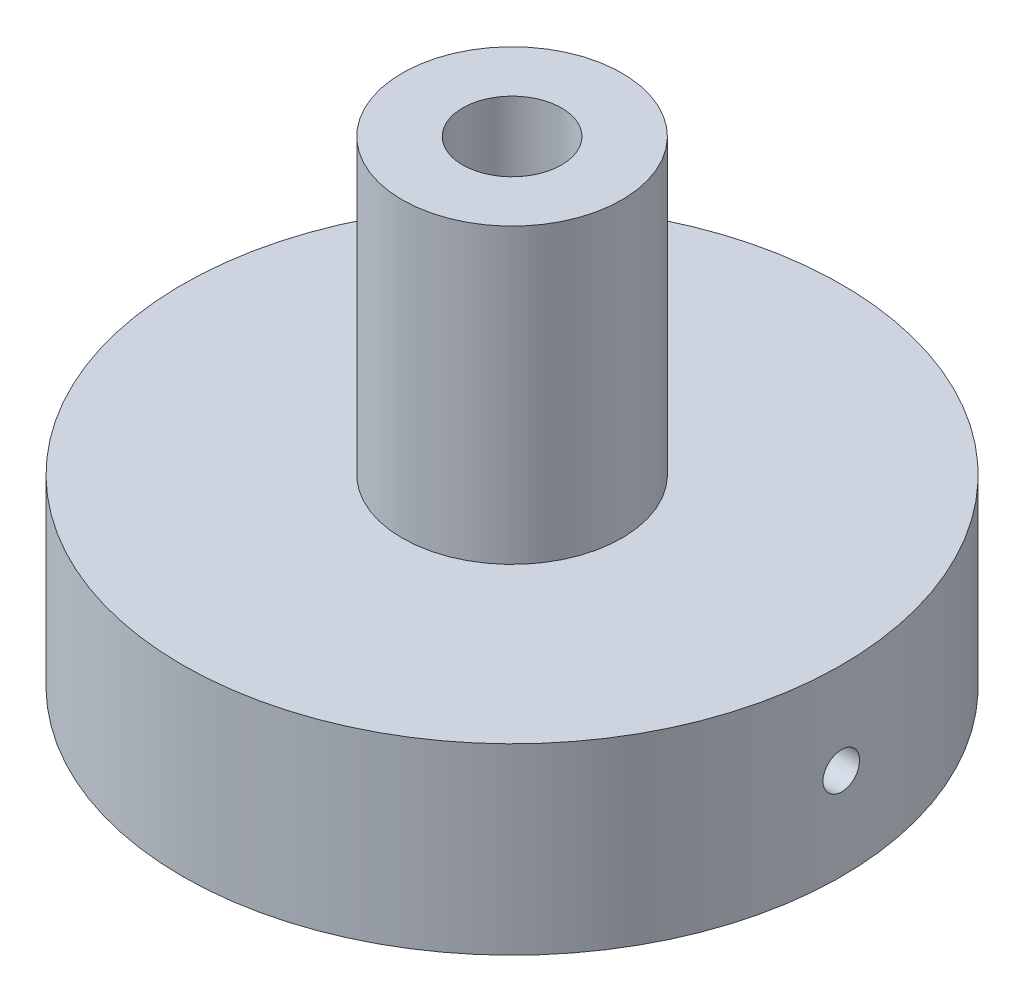
ISO-10303-21;
HEADER;
FILE_DESCRIPTION(('STEP AP214'),'2;1');
FILE_NAME('part.step','',(''),(''),'','','');
FILE_SCHEMA(('AUTOMOTIVE_DESIGN { 1 0 10303 214 1 1 1 1 }'));
ENDSEC;
DATA;
#1=APPLICATION_CONTEXT('core data for automotive mechanical design processes');
#2=APPLICATION_PROTOCOL_DEFINITION('international standard','automotive_design',2000,#1);
#3=PRODUCT_CONTEXT('',#1,'mechanical');
#4=PRODUCT('Part','Part','',(#3));
#5=PRODUCT_RELATED_PRODUCT_CATEGORY('part','',(#4));
#6=PRODUCT_DEFINITION_FORMATION('','',#4);
#7=PRODUCT_DEFINITION_CONTEXT('part definition',#1,'design');
#8=PRODUCT_DEFINITION('design','',#6,#7);
#9=PRODUCT_DEFINITION_SHAPE('','',#8);
#10=(LENGTH_UNIT() NAMED_UNIT(*) SI_UNIT(.MILLI.,.METRE.));
#11=(NAMED_UNIT(*) PLANE_ANGLE_UNIT() SI_UNIT($,.RADIAN.));
#12=(NAMED_UNIT(*) SI_UNIT($,.STERADIAN.) SOLID_ANGLE_UNIT());
#13=UNCERTAINTY_MEASURE_WITH_UNIT(LENGTH_MEASURE(1.E-05),#10,'distance_accuracy_value','');
#14=(GEOMETRIC_REPRESENTATION_CONTEXT(3) GLOBAL_UNCERTAINTY_ASSIGNED_CONTEXT((#13)) GLOBAL_UNIT_ASSIGNED_CONTEXT((#10,
#11,#12)) REPRESENTATION_CONTEXT('',''));
#15=CARTESIAN_POINT('',(0.,0.,0.));
#16=DIRECTION('',(0.,0.,1.));
#17=DIRECTION('',(1.,0.,0.));
#18=AXIS2_PLACEMENT_3D('',#15,#16,#17);
#19=CARTESIAN_POINT('',(0.,2.5,0.));
#20=DIRECTION('',(0.,-1.,0.));
#21=DIRECTION('',(0.,0.,-1.));
#22=AXIS2_PLACEMENT_3D('',#19,#20,#21);
#23=CYLINDRICAL_SURFACE('',#22,4.5);
#24=CARTESIAN_POINT('',(0.,0.,0.));
#25=DIRECTION('',(0.,1.,0.));
#26=DIRECTION('',(0.,0.,1.));
#27=AXIS2_PLACEMENT_3D('',#24,#25,#26);
#28=CIRCLE('',#27,4.5);
#29=CARTESIAN_POINT('',(0.,0.,4.5));
#30=VERTEX_POINT('',#29);
#31=EDGE_CURVE('E80',#30,#30,#28,.T.);
#32=ORIENTED_EDGE('',*,*,#31,.T.);
#33=EDGE_LOOP('',(#32));
#34=FACE_BOUND('',#33,.T.);
#35=CARTESIAN_POINT('',(0.,2.5,0.));
#36=DIRECTION('',(0.,1.,0.));
#37=DIRECTION('',(0.,0.,1.));
#38=AXIS2_PLACEMENT_3D('',#35,#36,#37);
#39=CIRCLE('',#38,4.5);
#40=CARTESIAN_POINT('',(0.,2.5,4.5));
#41=VERTEX_POINT('',#40);
#42=EDGE_CURVE('E79',#41,#41,#39,.T.);
#43=ORIENTED_EDGE('',*,*,#42,.F.);
#44=EDGE_LOOP('',(#43));
#45=FACE_BOUND('',#44,.T.);
#46=CARTESIAN_POINT('',(4.5,1.,0.));
#47=CARTESIAN_POINT('',(4.50000000000079,0.999999982829135,-0.00272645801680544));
#48=CARTESIAN_POINT('',(4.49999899452962,1.00004460080792,-0.00545291505725118));
#49=CARTESIAN_POINT('',(4.49999497264792,1.00022298385369,-0.0109029114291185));
#50=CARTESIAN_POINT('',(4.4999919562363,1.00035674896918,-0.0136264507589518));
#51=CARTESIAN_POINT('',(4.49998391247387,1.00071330327103,-0.0190676959405886));
#52=CARTESIAN_POINT('',(4.49997888512087,1.00093609255424,-0.0217854017860413));
#53=CARTESIAN_POINT('',(4.49996681947701,1.00147045126951,-0.0272120713179232));
#54=CARTESIAN_POINT('',(4.49995978118288,1.00178202084645,-0.0299210349900766));
#55=CARTESIAN_POINT('',(4.49994369365779,1.00249360806718,-0.0353273206292449));
#56=CARTESIAN_POINT('',(4.49993464442246,1.00289362590343,-0.0380246425709125));
#57=CARTESIAN_POINT('',(4.49991453501609,1.00378168105241,-0.0434047577270999));
#58=CARTESIAN_POINT('',(4.49990347483958,1.00426971860457,-0.0460875509020784));
#59=CARTESIAN_POINT('',(4.49987934355194,1.00533329087768,-0.051435737040496));
#60=CARTESIAN_POINT('',(4.49986627243425,1.00590882588424,-0.054101129947108));
#61=CARTESIAN_POINT('',(4.49983811926533,1.00714677697542,-0.0594116626959782));
#62=CARTESIAN_POINT('',(4.49982303720645,1.0078091933909,-0.0620568024610688));
#63=CARTESIAN_POINT('',(4.49979086215626,1.00922019825307,-0.0673239977536585));
#64=CARTESIAN_POINT('',(4.4997737691562,1.00996878707479,-0.0699460531806388));
#65=CARTESIAN_POINT('',(4.49973757222473,1.01155133546066,-0.0751642733351101));
#66=CARTESIAN_POINT('',(4.49971846828349,1.01238529544278,-0.0777604379357708));
#67=CARTESIAN_POINT('',(4.49967824947075,1.01413769348849,-0.0829240976904874));
#68=CARTESIAN_POINT('',(4.49965713458832,1.01505613201163,-0.0854915926884981));
#69=CARTESIAN_POINT('',(4.49961289389431,1.01697650405856,-0.0905951651798567));
#70=CARTESIAN_POINT('',(4.4995897680707,1.01797843808197,-0.0931312424851046));
#71=CARTESIAN_POINT('',(4.49954150549541,1.02006472868197,-0.0981692651632267));
#72=CARTESIAN_POINT('',(4.49951636873061,1.02114908579658,-0.100671210313175));
#73=CARTESIAN_POINT('',(4.49946408427406,1.02339906191263,-0.105638290788664));
#74=CARTESIAN_POINT('',(4.49943693656808,1.02456468148869,-0.108103425853758));
#75=CARTESIAN_POINT('',(4.49938063023024,1.02697593488482,-0.112994247669384));
#76=CARTESIAN_POINT('',(4.49935147158308,1.0282215693142,-0.115419934119338));
#77=CARTESIAN_POINT('',(4.49929114336397,1.03079151913318,-0.120229262440449));
#78=CARTESIAN_POINT('',(4.49925997377563,1.03211583516471,-0.12261290396837));
#79=CARTESIAN_POINT('',(4.49919562367525,1.03484173069043,-0.127335591185935));
#80=CARTESIAN_POINT('',(4.49916244314572,1.03624331085699,-0.129674636487252));
#81=CARTESIAN_POINT('',(4.49909407116407,1.03912223445865,-0.134305627727543));
#82=CARTESIAN_POINT('',(4.49905887969335,1.04059957859425,-0.136597573230767));
#83=CARTESIAN_POINT('',(4.49898648583043,1.04362844884922,-0.141131911765788));
#84=CARTESIAN_POINT('',(4.49894928341853,1.04517997569477,-0.143374304312184));
#85=CARTESIAN_POINT('',(4.49887286767433,1.04835555068674,-0.147807136865045));
#86=CARTESIAN_POINT('',(4.49883365432125,1.0499795995825,-0.149997576334341));
#87=CARTESIAN_POINT('',(4.49875321669578,1.05329848037145,-0.154324158273908));
#88=CARTESIAN_POINT('',(4.49871199240151,1.05499331303448,-0.156460300153239));
#89=CARTESIAN_POINT('',(4.49862753289477,1.05845194729468,-0.160676000572497));
#90=CARTESIAN_POINT('',(4.49858429765932,1.06021574967942,-0.162755558465828));
#91=CARTESIAN_POINT('',(4.49849581627131,1.06381043550163,-0.166855865138515));
#92=CARTESIAN_POINT('',(4.49845057009468,1.06564131974154,-0.168876613213861));
#93=CARTESIAN_POINT('',(4.49835806682538,1.06936820959529,-0.172857137424079));
#94=CARTESIAN_POINT('',(4.49831080970757,1.07126421602349,-0.174816912795898));
#95=CARTESIAN_POINT('',(4.49821428455701,1.07511932087527,-0.178673394035526));
#96=CARTESIAN_POINT('',(4.49816501649801,1.07707842012208,-0.180570099079742));
#97=CARTESIAN_POINT('',(4.49806446946618,1.08105761370492,-0.18429840960862));
#98=CARTESIAN_POINT('',(4.498013190466,1.08307770886993,-0.18613001420779));
#99=CARTESIAN_POINT('',(4.49790862155289,1.08717673209994,-0.189726163471797));
#100=CARTESIAN_POINT('',(4.49785533161153,1.08925566099644,-0.191490707188026));
#101=CARTESIAN_POINT('',(4.49774674081715,1.09347012653142,-0.194950846090327));
#102=CARTESIAN_POINT('',(4.49769143993461,1.09560566400067,-0.196646440263602));
#103=CARTESIAN_POINT('',(4.49757882725895,1.09993106093611,-0.199966865284481));
#104=CARTESIAN_POINT('',(4.49752151543523,1.10212092122898,-0.201591695054174));
#105=CARTESIAN_POINT('',(4.4974048808783,1.10655261992622,-0.204768852215054));
#106=CARTESIAN_POINT('',(4.49734555811339,1.10879445914976,-0.206321178462445));
#107=CARTESIAN_POINT('',(4.49722490167519,1.11332771619126,-0.209351667129848));
#108=CARTESIAN_POINT('',(4.49716356796911,1.11561913481744,-0.210829828339564));
#109=CARTESIAN_POINT('',(4.49703888964963,1.12024909808389,-0.213710404864944));
#110=CARTESIAN_POINT('',(4.49697554500235,1.12258764351791,-0.215112818903346));
#111=CARTESIAN_POINT('',(4.49684684480162,1.12730935738158,-0.217840400094885));
#112=CARTESIAN_POINT('',(4.4967814892132,1.12969252658697,-0.219165565903492));
#113=CARTESIAN_POINT('',(4.49664876713111,1.13450093721595,-0.22173723232616));
#114=CARTESIAN_POINT('',(4.49658140060138,1.13692617939368,-0.222983731528286));
#115=CARTESIAN_POINT('',(4.49644465663835,1.14181614016119,-0.225396730628625));
#116=CARTESIAN_POINT('',(4.49637527916791,1.14428085947991,-0.226563229047523));
#117=CARTESIAN_POINT('',(4.49623451332235,1.14924713647286,-0.228814978099816));
#118=CARTESIAN_POINT('',(4.496163124909,1.1517486948472,-0.2299002271867));
#119=CARTESIAN_POINT('',(4.49601833718687,1.15678597246855,-0.231988316057351));
#120=CARTESIAN_POINT('',(4.49594493783877,1.15932169238319,-0.232991154227767));
#121=CARTESIAN_POINT('',(4.4957961282178,1.16442457904029,-0.234913347954973));
#122=CARTESIAN_POINT('',(4.49572071790453,1.16699174641428,-0.235832701832094));
#123=CARTESIAN_POINT('',(4.49556788646785,1.17215478029394,-0.237586943017981));
#124=CARTESIAN_POINT('',(4.49549046530294,1.17475064739137,-0.238421828581449));
#125=CARTESIAN_POINT('',(4.49533361174032,1.17996830229018,-0.240006239594292));
#126=CARTESIAN_POINT('',(4.49525417930001,1.18259009063992,-0.240755763233599));
#127=CARTESIAN_POINT('',(4.49509330476925,1.18785678193745,-0.242168648217114));
#128=CARTESIAN_POINT('',(4.49501186263515,1.1905016853866,-0.242832007687511));
#129=CARTESIAN_POINT('',(4.49484696281517,1.19581177580535,-0.244071854377526));
#130=CARTESIAN_POINT('',(4.49476350508441,1.19847696322568,-0.244648339660783));
#131=CARTESIAN_POINT('',(4.49459459610223,1.20382476967665,-0.245713820998167));
#132=CARTESIAN_POINT('',(4.49450914480533,1.20650738910385,-0.246202815054747));
#133=CARTESIAN_POINT('',(4.49433616647204,1.21188718573952,-0.247092790627091));
#134=CARTESIAN_POINT('',(4.49424863938719,1.21458436328677,-0.24749377008565));
#135=CARTESIAN_POINT('',(4.49407181633867,1.21999039893776,-0.248207287268497));
#136=CARTESIAN_POINT('',(4.49398252033274,1.22269925731928,-0.248519822877617));
#137=CARTESIAN_POINT('',(4.49380101418655,1.22812571944627,-0.249056118150398));
#138=CARTESIAN_POINT('',(4.49370880397507,1.23084332340399,-0.249279875642798));
#139=CARTESIAN_POINT('',(4.4935257437315,1.23628450183132,-0.249638374300205));
#140=CARTESIAN_POINT('',(4.49343489373348,1.23900807644848,-0.249773113239852));
#141=CARTESIAN_POINT('',(4.49323860136768,1.24445778161076,-0.249953434134212));
#142=CARTESIAN_POINT('',(4.49313315862728,1.24718391221938,-0.249999013811763));
#143=CARTESIAN_POINT('',(4.49298771311119,1.25196411122928,-0.250000714691134));
#144=CARTESIAN_POINT('',(4.49293797980428,1.25401786978539,-0.249976150443854));
#145=CARTESIAN_POINT('',(4.49286090171626,1.2587423349927,-0.249861381992554));
#146=CARTESIAN_POINT('',(4.49284479086705,1.261412799423,-0.24975365630434));
#147=CARTESIAN_POINT('',(4.49282943442006,1.26736621825612,-0.24941780780716));
#148=CARTESIAN_POINT('',(4.49283495339598,1.2706479286171,-0.249167595457754));
#149=CARTESIAN_POINT('',(4.49286892216874,1.27781447841555,-0.248478642029944));
#150=CARTESIAN_POINT('',(4.49290148676499,1.28169675158396,-0.248013306184042));
#151=CARTESIAN_POINT('',(4.49298933184487,1.29004758970573,-0.246813058324371));
#152=CARTESIAN_POINT('',(4.49304739132845,1.29451172540462,-0.24604714199761));
#153=CARTESIAN_POINT('',(4.49314923143775,1.30139865191092,-0.24467204601958));
#154=CARTESIAN_POINT('',(4.49318772949752,1.30383860787431,-0.244146745715539));
#155=CARTESIAN_POINT('',(4.49327106078565,1.30885241831485,-0.242988509008493));
#156=CARTESIAN_POINT('',(4.49331613876742,1.31142519968001,-0.242350919523885));
#157=CARTESIAN_POINT('',(4.49341265963331,1.31669862824194,-0.240954686368067));
#158=CARTESIAN_POINT('',(4.4934643204412,1.3193979752829,-0.240191149588976));
#159=CARTESIAN_POINT('',(4.49357403135637,1.32491749902694,-0.238529089980028));
#160=CARTESIAN_POINT('',(4.49363227670035,1.32773613081184,-0.237625445400186));
#161=CARTESIAN_POINT('',(4.49375517755889,1.33348590041604,-0.235668839974184));
#162=CARTESIAN_POINT('',(4.49382000899489,1.33641521969177,-0.234610543773701));
#163=CARTESIAN_POINT('',(4.49395609986147,1.34237668245577,-0.232330008800951));
#164=CARTESIAN_POINT('',(4.49402751862438,1.34540670712759,-0.231102238200249));
#165=CARTESIAN_POINT('',(4.49417679946166,1.35155840904758,-0.228467959836766));
#166=CARTESIAN_POINT('',(4.49425480651527,1.3546776393715,-0.227055743707505));
#167=CARTESIAN_POINT('',(4.49441727749604,1.36099498141355,-0.224037754976576));
#168=CARTESIAN_POINT('',(4.49450187391544,1.36419029033583,-0.222426120290226));
#169=CARTESIAN_POINT('',(4.49467753440938,1.37064530966527,-0.218994614250967));
#170=CARTESIAN_POINT('',(4.49476871998836,1.37390183372186,-0.217168753051448));
#171=CARTESIAN_POINT('',(4.49495757253684,1.38046299640598,-0.213294435968355));
#172=CARTESIAN_POINT('',(4.49505535151137,1.38376403796181,-0.21123989171534));
#173=CARTESIAN_POINT('',(4.49525738605838,1.39039605168712,-0.206894379967704));
#174=CARTESIAN_POINT('',(4.49536174453342,1.39372298963977,-0.204597258412954));
#175=CARTESIAN_POINT('',(4.49557700091166,1.4003866515969,-0.199753508645682));
#176=CARTESIAN_POINT('',(4.49568799624747,1.4037188794295,-0.197200696740967));
#177=CARTESIAN_POINT('',(4.49591631713308,1.41037092511344,-0.191833515935032));
#178=CARTESIAN_POINT('',(4.49603372522526,1.41368576033887,-0.189012975062287));
#179=CARTESIAN_POINT('',(4.49627573078524,1.42027888452822,-0.18309942698873));
#180=CARTESIAN_POINT('',(4.49640043546482,1.42355168735192,-0.180000298844714));
#181=CARTESIAN_POINT('',(4.49662001390007,1.4291722045677,-0.174382243985315));
#182=CARTESIAN_POINT('',(4.49671497754765,1.43155585843599,-0.171899140260578));
#183=CARTESIAN_POINT('',(4.49690029687421,1.43617664621469,-0.166882218317377));
#184=CARTESIAN_POINT('',(4.4969907047822,1.4384156479319,-0.164350123851721));
#185=CARTESIAN_POINT('',(4.49716759709713,1.44274899063637,-0.15924456421512));
#186=CARTESIAN_POINT('',(4.49725412307402,1.44484523389104,-0.15667271439393));
#187=CARTESIAN_POINT('',(4.49742307100506,1.44889547611028,-0.151496487747561));
#188=CARTESIAN_POINT('',(4.49750553946476,1.45085140330372,-0.148893621143023));
#189=CARTESIAN_POINT('',(4.49766641725435,1.45462381622689,-0.143663809458895));
#190=CARTESIAN_POINT('',(4.49774487400736,1.45644225025838,-0.141038270993097));
#191=CARTESIAN_POINT('',(4.49789771440674,1.45994285786816,-0.135771132001995));
#192=CARTESIAN_POINT('',(4.49797214759215,1.46162699363406,-0.133130836842803));
#193=CARTESIAN_POINT('',(4.49811694207672,1.4648625150029,-0.127841772597173));
#194=CARTESIAN_POINT('',(4.49818735485519,1.46641587097161,-0.125194210099526));
#195=CARTESIAN_POINT('',(4.49832410564259,1.46939363587136,-0.119897767738886));
#196=CARTESIAN_POINT('',(4.49839049727172,1.47082001791427,-0.117249998424132));
#197=CARTESIAN_POINT('',(4.49851920378585,1.47354789323011,-0.111959869165651));
#198=CARTESIAN_POINT('',(4.49858157454562,1.47485135725886,-0.109318526656334));
#199=CARTESIAN_POINT('',(4.49870223693522,1.47733767467581,-0.104047551371939));
#200=CARTESIAN_POINT('',(4.49876058684546,1.47852249167546,-0.101418846018091));
#201=CARTESIAN_POINT('',(4.49887320507607,1.48077597935395,-0.0961790243282553));
#202=CARTESIAN_POINT('',(4.4989275342393,1.48184660202446,-0.0935687486539065));
#203=CARTESIAN_POINT('',(4.49903210830558,1.48387631952315,-0.088371252993345));
#204=CARTESIAN_POINT('',(4.49908241678748,1.48483735055908,-0.0857847902626409));
#205=CARTESIAN_POINT('',(4.49917894674325,1.48665262792431,-0.0806399796695123));
#206=CARTESIAN_POINT('',(4.49922523471807,1.48750879080267,-0.0780823091962128));
#207=CARTESIAN_POINT('',(4.4993137203612,1.48911916935863,-0.0729997593615972));
#208=CARTESIAN_POINT('',(4.49935598766664,1.48987527839251,-0.070475480823052));
#209=CARTESIAN_POINT('',(4.49943642972882,1.49129046211558,-0.0654639690719945));
#210=CARTESIAN_POINT('',(4.49947467745522,1.49195140354947,-0.0629772646477914));
#211=CARTESIAN_POINT('',(4.49954707330151,1.49318118905461,-0.0580449291232673));
#212=CARTESIAN_POINT('',(4.49958129808048,1.49375187074661,-0.0555997550199679));
#213=CARTESIAN_POINT('',(4.499676621652,1.49531341581898,-0.048422072303377));
#214=CARTESIAN_POINT('',(4.49973327289766,1.49620426649772,-0.0436673080763196));
#215=CARTESIAN_POINT('',(4.49982979934251,1.49767006958274,-0.0343596180405833));
#216=CARTESIAN_POINT('',(4.49987038654314,1.49825889293178,-0.0298088634879173));
#217=CARTESIAN_POINT('',(4.49993476336316,1.49916020951983,-0.0209286840898162));
#218=CARTESIAN_POINT('',(4.49995934313319,1.49948593214327,-0.0166006087089088));
#219=CARTESIAN_POINT('',(4.49999144669463,1.49989960887173,-0.00818126580138848));
#220=CARTESIAN_POINT('',(4.49999986569883,1.5000000980725,-0.00409061421390965));
#221=CARTESIAN_POINT('',(4.5,1.5,-2.51505718143839E-13));
#222=B_SPLINE_CURVE_WITH_KNOTS('',3,(#46,#47,#48,#49,#50,#51,#52,#53,#54,#55,#56,#57,#58,#59,
#60,#61,#62,#63,#64,#65,#66,#67,#68,#69,#70,#71,#72,#73,#74,#75,#76,#77,#78,#79,#80,#81,#82,#83,
#84,#85,#86,#87,#88,#89,#90,#91,#92,#93,#94,#95,#96,#97,#98,#99,#100,#101,#102,#103,#104,#105,
#106,#107,#108,#109,#110,#111,#112,#113,#114,#115,#116,#117,#118,#119,#120,#121,#122,#123,#124,
#125,#126,#127,#128,#129,#130,#131,#132,#133,#134,#135,#136,#137,#138,#139,#140,#141,#142,#143,
#144,#145,#146,#147,#148,#149,#150,#151,#152,#153,#154,#155,#156,#157,#158,#159,#160,#161,#162,
#163,#164,#165,#166,#167,#168,#169,#170,#171,#172,#173,#174,#175,#176,#177,#178,#179,#180,#181,
#182,#183,#184,#185,#186,#187,#188,#189,#190,#191,#192,#193,#194,#195,#196,#197,#198,#199,#200,
#201,#202,#203,#204,#205,#206,#207,#208,#209,#210,#211,#212,#213,#214,#215,#216,#217,#218,#219,
#220,#221),.UNSPECIFIED.,.F.,.F.,(4,2,2,2,2,2,2,2,2,2,2,2,2,2,2,2,2,2,2,2,2,2,2,2,2,2,2,2,2,2,2,
2,2,2,2,2,2,2,2,2,2,2,2,2,2,2,2,2,2,2,2,2,2,2,2,2,2,2,2,2,2,2,2,2,2,2,2,2,2,2,2,2,2,2,2,2,2,2,2,
2,2,2,2,2,2,2,2,4),(0.,0.00817900741954895,0.0163580192888877,0.0245370400578072,
0.0327160741760824,0.0408951260934666,0.0490742002596847,0.0572533011244243,0.0654324331373308,
0.0736116007479976,0.0817908084059602,0.089970060560689,0.0981493616615821,0.106328716157957,
0.114508128499044,0.12268760313398,0.130867144511799,0.139046757081428,0.147226445291675,
0.155406213591227,0.16358606642864,0.171766008252331,0.179946043510572,0.188126176651483,
0.196306412123025,0.204486754372991,0.212667207849,0.22084777699849,0.229028466268709,
0.237209280106712,0.245390222959349,0.253571299273258,0.261752513494863,0.26993387007036,
0.278115373445714,0.286297028066652,0.294478838378652,0.30266080882694,0.310842943856482,
0.319025247911972,0.327207725437831,0.335390380878199,0.343573218676923,0.351756243277554,
0.35993945912334,0.368122870657215,0.376306482321798,0.384490298559377,0.392674323811911,
0.398837007552274,0.406853374948259,0.416724493636177,0.428450846743802,0.442032638196973,
0.449520180891502,0.457471757113334,0.465887377936605,0.474767051228267,0.48411078220598,
0.493918573864052,0.504190427303175,0.514926341988904,0.526126315956597,0.537790345975587,
0.549918427681944,0.562510555686786,0.57556672366533,0.589086924430672,0.599414191623516,
0.609555099121464,0.619509650464222,0.629277849500169,0.638859700408364,0.648255207722735,
0.657464376358706,0.666487211642579,0.675323719344009,0.683973905711975,0.692437777514701,
0.700715342084078,0.708806607365181,0.716711581971626,0.724430275247595,0.731962697337523,
0.746467243998623,0.760227073865608,0.773242283395425,0.785512993807326),.UNSPECIFIED.);
#223=CARTESIAN_POINT('',(4.5,1.,0.));
#224=VERTEX_POINT('',#223);
#225=CARTESIAN_POINT('',(4.50000000000008,1.50000000000148,-1.59796636497995E-13));
#226=VERTEX_POINT('',#225);
#227=EDGE_CURVE('E11',#224,#226,#222,.T.);
#228=ORIENTED_EDGE('',*,*,#227,.F.);
#229=CARTESIAN_POINT('',(4.5,1.5,0.));
#230=CARTESIAN_POINT('',(4.50000000000079,1.50000001715065,0.00272565344150179));
#231=CARTESIAN_POINT('',(4.49999899453017,1.49995542551114,0.0054513059080778));
#232=CARTESIAN_POINT('',(4.49999497265067,1.49977714771774,0.010899695714023));
#233=CARTESIAN_POINT('',(4.49999195624069,1.49964346151535,0.0136224330518045));
#234=CARTESIAN_POINT('',(4.49998391248265,1.49928711746846,0.0190620794101077));
#235=CARTESIAN_POINT('',(4.49997888513239,1.49906445952709,0.0217789884242807));
#236=CARTESIAN_POINT('',(4.49996681949513,1.49853041563666,0.0272040720228861));
#237=CARTESIAN_POINT('',(4.49995978120484,1.49821902954272,0.0299122465930469));
#238=CARTESIAN_POINT('',(4.49994369368854,1.4975078610378,0.0353169643125665));
#239=CARTESIAN_POINT('',(4.49993464445814,1.49710807843436,0.0380135074365853));
#240=CARTESIAN_POINT('',(4.49991453506275,1.49622054499611,0.0433920777784212));
#241=CARTESIAN_POINT('',(4.49990347489228,1.49573279392186,0.0460741049567087));
#242=CARTESIAN_POINT('',(4.49987934361782,1.49466984523511,0.0514207744364331));
#243=CARTESIAN_POINT('',(4.49986627250725,1.49409464733699,0.0540854166810594));
#244=CARTESIAN_POINT('',(4.49983811935371,1.49285742036913,0.0593944659269891));
#245=CARTESIAN_POINT('',(4.49982303730306,1.49219539096851,0.0620388728511473));
#246=CARTESIAN_POINT('',(4.49979086227044,1.49078520921015,0.0673046227373916));
#247=CARTESIAN_POINT('',(4.49977376927971,1.49003705647736,0.0699259655989881));
#248=CARTESIAN_POINT('',(4.49973757236801,1.48845542840418,0.0751427833164307));
#249=CARTESIAN_POINT('',(4.49971846843719,1.4876219526458,0.0777382580454829));
#250=CARTESIAN_POINT('',(4.49967824964641,1.48587057013771,0.0829005631283132));
#251=CARTESIAN_POINT('',(4.49965713477551,1.48495266292844,0.0854673933260905));
#252=CARTESIAN_POINT('',(4.49961289410565,1.483033399451,0.0905696636209778));
#253=CARTESIAN_POINT('',(4.49958976829466,1.48203204268319,0.0931051035300409));
#254=CARTESIAN_POINT('',(4.49954150574573,1.47994695128586,0.0981418811032971));
#255=CARTESIAN_POINT('',(4.49951636899465,1.47886321611829,0.100643218544627));
#256=CARTESIAN_POINT('',(4.49946408456664,1.47661452723769,0.105609115520576));
#257=CARTESIAN_POINT('',(4.49943693687548,1.47544957294998,0.108073674794821));
#258=CARTESIAN_POINT('',(4.49938063056839,1.4730396920241,0.11296337911925));
#259=CARTESIAN_POINT('',(4.49935147193714,1.47179476477656,0.115388523868938));
#260=CARTESIAN_POINT('',(4.49929114375098,1.46922626967163,0.12019680499144));
#261=CARTESIAN_POINT('',(4.49925997417964,1.46790270117224,0.12257994102111));
#262=CARTESIAN_POINT('',(4.4991956241144,1.46517833942517,0.127301655490236));
#263=CARTESIAN_POINT('',(4.49916244360298,1.46377754550506,0.12964023354147));
#264=CARTESIAN_POINT('',(4.49909407165866,1.46090023138439,0.134270330506719));
#265=CARTESIAN_POINT('',(4.49905888020715,1.45942371048327,0.136561848985101));
#266=CARTESIAN_POINT('',(4.49898648638376,1.45639652187175,0.141095375599847));
#267=CARTESIAN_POINT('',(4.49894928399217,1.45484585343507,0.143337383250937));
#268=CARTESIAN_POINT('',(4.49887286828969,1.45167202853721,0.147769489970522));
#269=CARTESIAN_POINT('',(4.49883365495801,1.45004887132658,0.149959588501985));
#270=CARTESIAN_POINT('',(4.49875321737646,1.44673180520475,0.154285534271313));
#271=CARTESIAN_POINT('',(4.4987119931047,1.44503789552358,0.156421380918385));
#272=CARTESIAN_POINT('',(4.49862753364407,1.44158113646626,0.160636538243459));
#273=CARTESIAN_POINT('',(4.49858429843222,1.4398182863024,0.162715848275024));
#274=CARTESIAN_POINT('',(4.49849581709251,1.43622553202857,0.16681570817301));
#275=CARTESIAN_POINT('',(4.49845057094058,1.43439562711601,0.168836257335591));
#276=CARTESIAN_POINT('',(4.4983580677218,1.43067072081969,0.172816434158108));
#277=CARTESIAN_POINT('',(4.49831081062978,1.42877571862139,0.17477606105517));
#278=CARTESIAN_POINT('',(4.49821428553192,1.4249226448605,0.178632297179646));
#279=CARTESIAN_POINT('',(4.49816501749982,1.42296457247449,0.180528905583657));
#280=CARTESIAN_POINT('',(4.49806447052288,1.41898745290858,0.18425707596774));
#281=CARTESIAN_POINT('',(4.49801319155069,1.41696840489951,0.18608863706252));
#282=CARTESIAN_POINT('',(4.49790862269468,1.4128714938808,0.189684753656663));
#283=CARTESIAN_POINT('',(4.49785533278241,1.41079363003942,0.191449308207627));
#284=CARTESIAN_POINT('',(4.49774674204731,1.40658131006185,0.194909524221131));
#285=CARTESIAN_POINT('',(4.49769144119496,1.40444685309464,0.196605184671093));
#286=CARTESIAN_POINT('',(4.49757882858079,1.40012363010592,0.199925798687049));
#287=CARTESIAN_POINT('',(4.49752151678835,1.39793486325745,0.201550751175358));
#288=CARTESIAN_POINT('',(4.4974048822951,1.393505361839,0.204728211110074));
#289=CARTESIAN_POINT('',(4.49734555956258,1.39126462644953,0.206280717412916));
#290=CARTESIAN_POINT('',(4.49722490319025,1.38673358486954,0.209311624315607));
#291=CARTESIAN_POINT('',(4.49716356951765,1.38444327787046,0.210790023705393));
#292=CARTESIAN_POINT('',(4.49703889126624,1.37981554301533,0.213671135394063));
#293=CARTESIAN_POINT('',(4.49697554665354,1.37747811436515,0.215073846415924));
#294=CARTESIAN_POINT('',(4.49684684652309,1.37275863655474,0.21780208094555));
#295=CARTESIAN_POINT('',(4.49678149097034,1.37037658661836,0.219127603109028));
#296=CARTESIAN_POINT('',(4.49664876896071,1.36557041431062,0.221700042068337));
#297=CARTESIAN_POINT('',(4.49658140246776,1.36314629118466,0.222946957452475));
#298=CARTESIAN_POINT('',(4.49644465857939,1.3582585655752,0.225360849085789));
#299=CARTESIAN_POINT('',(4.49637528114682,1.35579496236227,0.226527823855889));
#300=CARTESIAN_POINT('',(4.49623451537811,1.3508309118849,0.228780586006697));
#301=CARTESIAN_POINT('',(4.49616312700371,1.34833046391983,0.229866371841133));
#302=CARTESIAN_POINT('',(4.49601833936067,1.34329539865338,0.231955594714242));
#303=CARTESIAN_POINT('',(4.49594494005269,1.3407607806838,0.2329590301398));
#304=CARTESIAN_POINT('',(4.49579613051284,1.33566008667296,0.234882478879111));
#305=CARTESIAN_POINT('',(4.49572072024053,1.33309400999956,0.235802490513424));
#306=CARTESIAN_POINT('',(4.49556788888781,1.32793314348934,0.23755810759257));
#307=CARTESIAN_POINT('',(4.49549046776587,1.3253383530601,0.238393711292327));
#308=CARTESIAN_POINT('',(4.49533361428698,1.32012283467434,0.239979618715618));
#309=CARTESIAN_POINT('',(4.49525418188741,1.31750210616876,0.240729920629294));
#310=CARTESIAN_POINT('',(4.49509330745163,1.31223751494844,0.242144421940663));
#311=CARTESIAN_POINT('',(4.49501186537175,1.30959365173162,0.242808619464741));
#312=CARTESIAN_POINT('',(4.49484696561512,1.30428561937677,0.244050201562283));
#313=CARTESIAN_POINT('',(4.49476350789347,1.30162144978725,0.244627584199568));
#314=CARTESIAN_POINT('',(4.4945945991031,1.29627565384952,0.245694918954766));
#315=CARTESIAN_POINT('',(4.49450914798889,1.29359402710396,0.246184869075296));
#316=CARTESIAN_POINT('',(4.49433616937837,1.28821618783618,0.247076814751305));
#317=CARTESIAN_POINT('',(4.49424864183355,1.28551997497435,0.247478808249723));
#318=CARTESIAN_POINT('',(4.49407182026875,1.28011583830284,0.248194410731733));
#319=CARTESIAN_POINT('',(4.49398252620655,1.2774079142145,0.248508017600282));
#320=CARTESIAN_POINT('',(4.49380101498223,1.27198328630585,0.249046511382402));
#321=CARTESIAN_POINT('',(4.49370879774864,1.26926658227232,0.249271396124805));
#322=CARTESIAN_POINT('',(4.49352575692746,1.26382717137319,0.249632205254866));
#323=CARTESIAN_POINT('',(4.49343493337479,1.26110446435914,0.249768127417255));
#324=CARTESIAN_POINT('',(4.49323856900098,1.25565644179352,0.249950865642883));
#325=CARTESIAN_POINT('',(4.49313302780382,1.25293112617708,0.249997679428921));
#326=CARTESIAN_POINT('',(4.49304967426984,1.25018800993294,0.249999929888701));
#327=CARTESIAN_POINT('',(4.49304915584807,1.25017091957531,0.249999942157568));
#328=CARTESIAN_POINT('',(4.49304850760442,1.25013673619044,0.249999963190352));
#329=CARTESIAN_POINT('',(4.49304837766083,1.25011964316572,0.249999971955367));
#330=CARTESIAN_POINT('',(4.49304837757138,1.25008545711499,0.249999985978505));
#331=CARTESIAN_POINT('',(4.49304850742551,1.25006836408897,0.249999991236629));
#332=CARTESIAN_POINT('',(4.49304915548812,1.25003418069807,0.249999998247936));
#333=CARTESIAN_POINT('',(4.49304967381828,1.25001709033569,0.25000000000002));
#334=CARTESIAN_POINT('',(4.49313262146942,1.2472868718832,0.249999999996736));
#335=CARTESIAN_POINT('',(4.49323765291847,1.24457441628147,0.249955843009315));
#336=CARTESIAN_POINT('',(4.49343307814205,1.23915195822308,0.249779255931383));
#337=CARTESIAN_POINT('',(4.49352347206199,1.23644195574231,0.24964682671791));
#338=CARTESIAN_POINT('',(4.49370565707245,1.23102775662594,0.249293831463579));
#339=CARTESIAN_POINT('',(4.49379744814981,1.22832355993602,0.24907326625097));
#340=CARTESIAN_POINT('',(4.49397813101779,1.22292370948881,0.248544228680098));
#341=CARTESIAN_POINT('',(4.49406702283406,1.22022805565605,0.248235757100608));
#342=CARTESIAN_POINT('',(4.49424305839734,1.21484818251928,0.247531229648743));
#343=CARTESIAN_POINT('',(4.49433020215888,1.21216396312032,0.247135174505134));
#344=CARTESIAN_POINT('',(4.49450243314891,1.20680979484802,0.24625589564331));
#345=CARTESIAN_POINT('',(4.49458752039339,1.20413984586378,0.245772672603476));
#346=CARTESIAN_POINT('',(4.49475572100792,1.19881705097006,0.244719565997586));
#347=CARTESIAN_POINT('',(4.49483883439227,1.19616420493682,0.244149683059301));
#348=CARTESIAN_POINT('',(4.49500306511855,1.19087842844904,0.24292385689909));
#349=CARTESIAN_POINT('',(4.49508418247388,1.18824549786107,0.242267914254249));
#350=CARTESIAN_POINT('',(4.49524489935169,1.18298689108011,0.240866541769307));
#351=CARTESIAN_POINT('',(4.49532448712703,1.18036134884889,0.240120607837517));
#352=CARTESIAN_POINT('',(4.49548164743384,1.17513605685006,0.238543157492874));
#353=CARTESIAN_POINT('',(4.49555921997673,1.17253630693659,0.237711641564305));
#354=CARTESIAN_POINT('',(4.49571235027472,1.16736538810085,0.235963914853921));
#355=CARTESIAN_POINT('',(4.49578790804013,1.1647942190325,0.235047704505218));
#356=CARTESIAN_POINT('',(4.49593700866236,1.15968322099954,0.233131567721023));
#357=CARTESIAN_POINT('',(4.49601055152839,1.15714339189179,0.232131641668021));
#358=CARTESIAN_POINT('',(4.49615562238562,1.15209779921735,0.23004914204171));
#359=CARTESIAN_POINT('',(4.49622715038493,1.14959203551363,0.228966568800972));
#360=CARTESIAN_POINT('',(4.49636819150107,1.14461726283024,0.226719932109333));
#361=CARTESIAN_POINT('',(4.4964377046249,1.14214825372273,0.225555868941939));
#362=CARTESIAN_POINT('',(4.49657471599354,1.1372496401789,0.22314749719761));
#363=CARTESIAN_POINT('',(4.49664221424426,1.13482003562699,0.221903188856121));
#364=CARTESIAN_POINT('',(4.49677519586711,1.13000283908399,0.219335657734693));
#365=CARTESIAN_POINT('',(4.49684067924407,1.12761524699253,0.21801243514329));
#366=CARTESIAN_POINT('',(4.49696963112068,1.12288463839388,0.215288491243678));
#367=CARTESIAN_POINT('',(4.49703309962406,1.12054162180449,0.21388777007839));
#368=CARTESIAN_POINT('',(4.49715802175455,1.11590267961484,0.211010327994137));
#369=CARTESIAN_POINT('',(4.4972194753843,1.1136067539534,0.209533607173912));
#370=CARTESIAN_POINT('',(4.49734036776864,1.10906445870198,0.206505746385298));
#371=CARTESIAN_POINT('',(4.49739980652476,1.10681808907463,0.204954606473041));
#372=CARTESIAN_POINT('',(4.49751666916296,1.10237731800135,0.201779568061495));
#373=CARTESIAN_POINT('',(4.49757409304546,1.10018291654455,0.200155669577434));
#374=CARTESIAN_POINT('',(4.49768692593752,1.0958484383566,0.196836852766214));
#375=CARTESIAN_POINT('',(4.4977423349464,1.09370836164368,0.195141934415218));
#376=CARTESIAN_POINT('',(4.49785113809231,1.08948483138769,0.191682892939932));
#377=CARTESIAN_POINT('',(4.49790453222757,1.08740137789449,0.189918769754702));
#378=CARTESIAN_POINT('',(4.49800930562734,1.08329333195,0.186323208067548));
#379=CARTESIAN_POINT('',(4.49806068488897,1.08126873958262,0.184491769469667));
#380=CARTESIAN_POINT('',(4.49816142854259,1.07728059078209,0.180763538781442));
#381=CARTESIAN_POINT('',(4.49821079293061,1.07531703446921,0.178866746562327));
#382=CARTESIAN_POINT('',(4.49830750683809,1.07145306734992,0.175009840726416));
#383=CARTESIAN_POINT('',(4.49835485635248,1.06955265670236,0.173049726950352));
#384=CARTESIAN_POINT('',(4.49844754051381,1.06581702289536,0.169068278193094));
#385=CARTESIAN_POINT('',(4.49849287515458,1.06398179993543,0.167046943024562));
#386=CARTESIAN_POINT('',(4.49858152956977,1.06037851369635,0.162945217526545));
#387=CARTESIAN_POINT('',(4.49862484933692,1.05861045065936,0.160864826984177));
#388=CARTESIAN_POINT('',(4.49870947400596,1.05514338454608,0.156647220317169));
#389=CARTESIAN_POINT('',(4.49875077889949,1.05344438175644,0.154510003956729));
#390=CARTESIAN_POINT('',(4.49883137382239,1.05011726245816,0.150181036381133));
#391=CARTESIAN_POINT('',(4.49887066384229,1.04848914628238,0.147989284909981));
#392=CARTESIAN_POINT('',(4.49894722901905,1.04530555060464,0.143553596537828));
#393=CARTESIAN_POINT('',(4.49898450416533,1.04375007148335,0.14130965936344));
#394=CARTESIAN_POINT('',(4.49905703959594,1.04071342249337,0.13677200519208));
#395=CARTESIAN_POINT('',(4.4990922998686,1.0392322530546,0.134478287907219));
#396=CARTESIAN_POINT('',(4.49916080555306,1.03634581639099,0.129843532729034));
#397=CARTESIAN_POINT('',(4.49919405095211,1.03494054964664,0.127502494536281));
#398=CARTESIAN_POINT('',(4.49925852689042,1.0322074299976,0.122775607729846));
#399=CARTESIAN_POINT('',(4.49928975741585,1.03087957762515,0.120389758808229));
#400=CARTESIAN_POINT('',(4.49935020360802,1.02830271537892,0.115575809016503));
#401=CARTESIAN_POINT('',(4.49937941925982,1.02705370609015,0.113147707833049));
#402=CARTESIAN_POINT('',(4.49943583570585,1.02463587416126,0.108251857534278));
#403=CARTESIAN_POINT('',(4.49946303648402,1.02346705215981,0.105784108103359));
#404=CARTESIAN_POINT('',(4.4995154231839,1.02121085299471,0.10081160808051));
#405=CARTESIAN_POINT('',(4.49954060908846,1.02012347652412,0.0983068571739249));
#406=CARTESIAN_POINT('',(4.4995889660422,1.01803133928931,0.0932630408885599));
#407=CARTESIAN_POINT('',(4.49961213707314,1.01702657927312,0.0907239751993205));
#408=CARTESIAN_POINT('',(4.49965646428073,1.01510075722885,0.0856142530759405));
#409=CARTESIAN_POINT('',(4.49967762043804,1.0141796960042,0.0830435963388208));
#410=CARTESIAN_POINT('',(4.49971791789949,1.01242226406682,0.0778734499657898));
#411=CARTESIAN_POINT('',(4.49973705918318,1.0115858942132,0.0752739600376961));
#412=CARTESIAN_POINT('',(4.49977332689849,1.00999874670785,0.0700489362909888));
#413=CARTESIAN_POINT('',(4.49979045330856,1.00924796997098,0.0674234021943294));
#414=CARTESIAN_POINT('',(4.49982269127772,1.00783281858071,0.0621491072902714));
#415=CARTESIAN_POINT('',(4.49983780281417,1.00716844489788,0.0595003462223206));
#416=CARTESIAN_POINT('',(4.49986601103718,1.00592681679745,0.0541824397061625));
#417=CARTESIAN_POINT('',(4.49987910770001,1.00534956340592,0.051513294018264));
#418=CARTESIAN_POINT('',(4.49990328617688,1.00428279963527,0.0461574826932844));
#419=CARTESIAN_POINT('',(4.49991436796609,1.00379329033733,0.0434708168407434));
#420=CARTESIAN_POINT('',(4.49993451669681,1.00290254421819,0.0380828486509074));
#421=CARTESIAN_POINT('',(4.49994358361241,1.00250130853276,0.0353815461257501));
#422=CARTESIAN_POINT('',(4.49995970259698,1.00178754487037,0.0299672039741516));
#423=CARTESIAN_POINT('',(4.49996675463894,1.00147501808305,0.0272541641908014));
#424=CARTESIAN_POINT('',(4.4999788438774,1.00093901039175,0.0218192597913231));
#425=CARTESIAN_POINT('',(4.49998388104579,1.00071553073041,0.019097395052578));
#426=CARTESIAN_POINT('',(4.49999194053796,1.00035786679385,0.0136477624824699));
#427=CARTESIAN_POINT('',(4.49999496283254,1.00022368381335,0.0109199945660916));
#428=CARTESIAN_POINT('',(4.4999989925791,1.00004474110445,0.00546148479117807));
#429=CARTESIAN_POINT('',(4.50000000000079,0.999999982721294,0.0027307428885229));
#430=CARTESIAN_POINT('',(4.5,1.,0.));
#431=B_SPLINE_CURVE_WITH_KNOTS('',3,(#229,#230,#231,#232,#233,#234,#235,#236,#237,#238,#239,
#240,#241,#242,#243,#244,#245,#246,#247,#248,#249,#250,#251,#252,#253,#254,#255,#256,#257,#258,
#259,#260,#261,#262,#263,#264,#265,#266,#267,#268,#269,#270,#271,#272,#273,#274,#275,#276,#277,
#278,#279,#280,#281,#282,#283,#284,#285,#286,#287,#288,#289,#290,#291,#292,#293,#294,#295,#296,
#297,#298,#299,#300,#301,#302,#303,#304,#305,#306,#307,#308,#309,#310,#311,#312,#313,#314,#315,
#316,#317,#318,#319,#320,#321,#322,#323,#324,#325,#326,#327,#328,#329,#330,#331,#332,#333,#334,
#335,#336,#337,#338,#339,#340,#341,#342,#343,#344,#345,#346,#347,#348,#349,#350,#351,#352,#353,
#354,#355,#356,#357,#358,#359,#360,#361,#362,#363,#364,#365,#366,#367,#368,#369,#370,#371,#372,
#373,#374,#375,#376,#377,#378,#379,#380,#381,#382,#383,#384,#385,#386,#387,#388,#389,#390,#391,
#392,#393,#394,#395,#396,#397,#398,#399,#400,#401,#402,#403,#404,#405,#406,#407,#408,#409,#410,
#411,#412,#413,#414,#415,#416,#417,#418,#419,#420,#421,#422,#423,#424,#425,#426,#427,#428,#429,
#430),.UNSPECIFIED.,.F.,.F.,(4,2,2,2,2,2,2,2,2,2,2,2,2,2,2,2,2,2,2,2,2,2,2,2,2,2,2,2,2,2,2,2,2,
2,2,2,2,2,2,2,2,2,2,2,2,2,2,2,2,2,2,2,2,2,2,2,2,2,2,2,2,2,2,2,2,2,2,2,2,2,2,2,2,2,2,2,2,2,2,2,2,
2,2,2,2,2,2,2,2,2,2,2,2,2,2,2,2,2,2,2,4),(0.,0.00817659401885432,0.0163531924888076,
0.0245297998609584,0.0327064205863902,0.0408830591161655,0.0490597199013169,0.0572364073928413,
0.0654131260416915,0.0735898802987699,0.0817666746149202,0.0899435134409212,0.0981204012274787,
0.106297342425219,0.11447434148468,0.122651402856306,0.13082853099044,0.139005730337316,
0.147183005347051,0.155360360469638,0.16353780015494,0.171715328852683,0.179892951012445,
0.188070671083654,0.196248493515577,0.204426422757314,0.212604463257791,0.220782619465752,
0.228960895829753,0.237139296798152,0.245317826819107,0.253496490340562,0.261675291810245,
0.269854235675658,0.278033326384073,0.286212568382519,0.29439196611778,0.302571524036388,
0.31075124658461,0.318931138208446,0.327111203353622,0.33529144646558,0.34347187198947,
0.351652484370147,0.359833288052161,0.368014287479749,0.37619548709683,0.384376891346998,
0.392558504673511,0.392609797828363,0.39266107491008,0.392712351989412,0.392763645137111,
0.400906544360306,0.409049362679889,0.41719210447988,0.425334774144424,0.433477376057784,
0.441619914604328,0.449762394168531,0.457904819134961,0.466095179893885,0.474285494308479,
0.482475766841548,0.490666001955962,0.498856204114656,0.507046377780615,0.515236527416875,
0.523426657486507,0.531616772452617,0.539806876778334,0.547996974926805,0.556187071361187,
0.564377170544641,0.57256727694032,0.58075739501137,0.588947529220914,0.597137684032051,
0.605327863907845,0.61351807331132,0.62170831670545,0.629898598553155,0.638088923317293,
0.646279295460649,0.654469719445933,0.66266019973577,0.670850740792691,0.67904134707913,
0.687232023057413,0.695422773189752,0.70361360193824,0.711804513764839,0.719995513131375,
0.728186604499534,0.736377792330849,0.744569081086695,0.752760475228285,0.760951979216656,
0.769143597512669,0.777335334576997,0.785527194870118),.UNSPECIFIED.);
#432=EDGE_CURVE('E46',#226,#224,#431,.T.);
#433=ORIENTED_EDGE('',*,*,#432,.F.);
#434=EDGE_LOOP('',(#228,#433));
#435=FACE_BOUND('',#434,.T.);
#436=ADVANCED_FACE('F32',(#34,#45,#435),#23,.T.);
#437=CARTESIAN_POINT('',(0.,2.5,0.));
#438=DIRECTION('',(0.,1.,0.));
#439=DIRECTION('',(0.,0.,1.));
#440=AXIS2_PLACEMENT_3D('',#437,#438,#439);
#441=PLANE('',#440);
#442=CARTESIAN_POINT('',(0.,2.5,0.));
#443=DIRECTION('',(0.,1.,0.));
#444=DIRECTION('',(0.,0.,1.));
#445=AXIS2_PLACEMENT_3D('',#442,#443,#444);
#446=CIRCLE('',#445,1.5);
#447=CARTESIAN_POINT('',(0.,2.5,1.5));
#448=VERTEX_POINT('',#447);
#449=EDGE_CURVE('E86',#448,#448,#446,.T.);
#450=ORIENTED_EDGE('',*,*,#449,.F.);
#451=EDGE_LOOP('',(#450));
#452=FACE_BOUND('',#451,.T.);
#453=ORIENTED_EDGE('',*,*,#42,.T.);
#454=EDGE_LOOP('',(#453));
#455=FACE_BOUND('',#454,.T.);
#456=ADVANCED_FACE('F131',(#452,#455),#441,.T.);
#457=CARTESIAN_POINT('',(0.,0.,0.));
#458=DIRECTION('',(0.,1.,0.));
#459=DIRECTION('',(0.,0.,1.));
#460=AXIS2_PLACEMENT_3D('',#457,#458,#459);
#461=PLANE('',#460);
#462=ORIENTED_EDGE('',*,*,#31,.F.);
#463=EDGE_LOOP('',(#462));
#464=FACE_BOUND('',#463,.T.);
#465=ADVANCED_FACE('F126',(#464),#461,.F.);
#466=CARTESIAN_POINT('',(0.,6.5,0.));
#467=DIRECTION('',(0.,1.,0.));
#468=DIRECTION('',(0.,0.,1.));
#469=AXIS2_PLACEMENT_3D('',#466,#467,#468);
#470=PLANE('',#469);
#471=CARTESIAN_POINT('',(0.,6.5,0.));
#472=DIRECTION('',(0.,1.,0.));
#473=DIRECTION('',(0.,0.,1.));
#474=AXIS2_PLACEMENT_3D('',#471,#472,#473);
#475=CIRCLE('',#474,1.5);
#476=CARTESIAN_POINT('',(0.,6.5,1.5));
#477=VERTEX_POINT('',#476);
#478=EDGE_CURVE('E83',#477,#477,#475,.T.);
#479=ORIENTED_EDGE('',*,*,#478,.T.);
#480=EDGE_LOOP('',(#479));
#481=FACE_BOUND('',#480,.T.);
#482=CARTESIAN_POINT('',(0.,6.5,0.));
#483=DIRECTION('',(0.,1.,0.));
#484=DIRECTION('',(0.,0.,1.));
#485=AXIS2_PLACEMENT_3D('',#482,#483,#484);
#486=CIRCLE('',#485,0.675);
#487=CARTESIAN_POINT('',(0.,6.5,0.675));
#488=VERTEX_POINT('',#487);
#489=EDGE_CURVE('E89',#488,#488,#486,.T.);
#490=ORIENTED_EDGE('',*,*,#489,.F.);
#491=EDGE_LOOP('',(#490));
#492=FACE_BOUND('',#491,.T.);
#493=ADVANCED_FACE('F123',(#481,#492),#470,.T.);
#494=CARTESIAN_POINT('',(0.,6.5,0.));
#495=DIRECTION('',(0.,-1.,0.));
#496=DIRECTION('',(0.,0.,-1.));
#497=AXIS2_PLACEMENT_3D('',#494,#495,#496);
#498=CYLINDRICAL_SURFACE('',#497,1.5);
#499=ORIENTED_EDGE('',*,*,#478,.F.);
#500=EDGE_LOOP('',(#499));
#501=FACE_BOUND('',#500,.T.);
#502=ORIENTED_EDGE('',*,*,#449,.T.);
#503=EDGE_LOOP('',(#502));
#504=FACE_BOUND('',#503,.T.);
#505=ADVANCED_FACE('F121',(#501,#504),#498,.T.);
#506=CARTESIAN_POINT('',(0.,6.5,0.));
#507=DIRECTION('',(0.,-1.,0.));
#508=DIRECTION('',(0.,0.,-1.));
#509=AXIS2_PLACEMENT_3D('',#506,#507,#508);
#510=CYLINDRICAL_SURFACE('',#509,0.675);
#511=ORIENTED_EDGE('',*,*,#489,.T.);
#512=EDGE_LOOP('',(#511));
#513=FACE_BOUND('',#512,.T.);
#514=CARTESIAN_POINT('',(0.,2.5,0.));
#515=DIRECTION('',(0.,1.,0.));
#516=DIRECTION('',(0.,0.,1.));
#517=AXIS2_PLACEMENT_3D('',#514,#515,#516);
#518=CIRCLE('',#517,0.675);
#519=CARTESIAN_POINT('',(0.,2.5,0.675));
#520=VERTEX_POINT('',#519);
#521=EDGE_CURVE('E57',#520,#520,#518,.F.);
#522=ORIENTED_EDGE('',*,*,#521,.T.);
#523=EDGE_LOOP('',(#522));
#524=FACE_BOUND('',#523,.T.);
#525=ADVANCED_FACE('F109',(#513,#524),#510,.F.);
#526=CARTESIAN_POINT('',(0.,2.5,0.));
#527=DIRECTION('',(0.,1.,0.));
#528=DIRECTION('',(0.,0.,1.));
#529=AXIS2_PLACEMENT_3D('',#526,#527,#528);
#530=CIRCLE('',#529,0.406492391350434);
#531=CARTESIAN_POINT('',(0.,2.5,0.406492391350434));
#532=VERTEX_POINT('',#531);
#533=EDGE_CURVE('E209',#532,#532,#530,.T.);
#534=ORIENTED_EDGE('',*,*,#533,.F.);
#535=EDGE_LOOP('',(#534));
#536=FACE_BOUND('',#535,.T.);
#537=ORIENTED_EDGE('',*,*,#521,.F.);
#538=EDGE_LOOP('',(#537));
#539=FACE_BOUND('',#538,.T.);
#540=ADVANCED_FACE('F105',(#536,#539),#441,.T.);
#541=CARTESIAN_POINT('',(0.,1.25,0.));
#542=DIRECTION('',(-1.,0.,0.));
#543=DIRECTION('',(0.,0.,1.));
#544=AXIS2_PLACEMENT_3D('',#541,#542,#543);
#545=CYLINDRICAL_SURFACE('',#544,0.25);
#546=CARTESIAN_POINT('',(0.320524670229601,1.25,0.25));
#547=CARTESIAN_POINT('',(0.32052725507343,1.23752129915593,0.249998234204969));
#548=CARTESIAN_POINT('',(0.321266774753919,1.22502712816588,0.249057516219155));
#549=CARTESIAN_POINT('',(0.324099636064897,1.20045069047521,0.245357744231601));
#550=CARTESIAN_POINT('',(0.326196911471958,1.18836972836771,0.242593406277945));
#551=CARTESIAN_POINT('',(0.331396252473027,1.16505429657993,0.235439534439535));
#552=CARTESIAN_POINT('',(0.334489821551808,1.15381362564466,0.231063699847873));
#553=CARTESIAN_POINT('',(0.341318887933927,1.13223976131923,0.220850945719764));
#554=CARTESIAN_POINT('',(0.345054364426179,1.12190653852536,0.215014073548373));
#555=CARTESIAN_POINT('',(0.353329903588471,1.10096945048389,0.201164502627525));
#556=CARTESIAN_POINT('',(0.35791153339141,1.09050355995644,0.192967994178226));
#557=CARTESIAN_POINT('',(0.367028748992097,1.07097885423485,0.175007336913603));
#558=CARTESIAN_POINT('',(0.37156429241153,1.06192124078149,0.165241863526742));
#559=CARTESIAN_POINT('',(0.380698254770043,1.04443507473395,0.143055050704424));
#560=CARTESIAN_POINT('',(0.38524348867068,1.03619984887733,0.130457256246468));
#561=CARTESIAN_POINT('',(0.393283491507673,1.02203097842205,0.103722160566404));
#562=CARTESIAN_POINT('',(0.396779271560037,1.01609511684598,0.0895863591767122));
#563=CARTESIAN_POINT('',(0.402014864644875,1.00732544209759,0.0616564052975453));
#564=CARTESIAN_POINT('',(0.403894444897105,1.00424236186442,0.0479674109538507));
#565=CARTESIAN_POINT('',(0.406231523479246,1.00041954409577,0.0201514090365704));
#566=CARTESIAN_POINT('',(0.406690452274901,0.999677449388173,0.00602485653366668));
#567=CARTESIAN_POINT('',(0.406171294955726,1.00052257520111,-0.0202805881781231));
#568=CARTESIAN_POINT('',(0.405372378059497,1.00181934264934,-0.0324737891978717));
#569=CARTESIAN_POINT('',(0.402736716413748,1.00614808559863,-0.0564303633219067));
#570=CARTESIAN_POINT('',(0.400899893238388,1.00918019222488,-0.0681937038737363));
#571=CARTESIAN_POINT('',(0.396337161466495,1.01685497326175,-0.0910461752031876));
#572=CARTESIAN_POINT('',(0.393607793932975,1.02150391803854,-0.102132480611757));
#573=CARTESIAN_POINT('',(0.387474229587356,1.03223957440083,-0.123378338487649));
#574=CARTESIAN_POINT('',(0.384069870702925,1.03832663135916,-0.133537667521325));
#575=CARTESIAN_POINT('',(0.376378391134714,1.0526039258515,-0.153976287014486));
#576=CARTESIAN_POINT('',(0.372034217787296,1.06096047173529,-0.1641177704086));
#577=CARTESIAN_POINT('',(0.363148325159665,1.07911020982474,-0.182942579415797));
#578=CARTESIAN_POINT('',(0.358606332497274,1.08890543762849,-0.191623800933245));
#579=CARTESIAN_POINT('',(0.349166853969228,1.11109440961753,-0.208379449195428));
#580=CARTESIAN_POINT('',(0.344295654636475,1.12365986974533,-0.216243257149925));
#581=CARTESIAN_POINT('',(0.335460304849856,1.15023415559077,-0.229712000148502));
#582=CARTESIAN_POINT('',(0.331494482247141,1.1642402500081,-0.235321114231946));
#583=CARTESIAN_POINT('',(0.325990697885379,1.18962314500593,-0.242862239956206));
#584=CARTESIAN_POINT('',(0.3240907009061,1.20075042590008,-0.245368818282207));
#585=CARTESIAN_POINT('',(0.32143372113653,1.22337124318525,-0.248840125230535));
#586=CARTESIAN_POINT('',(0.320675272375813,1.23486429044825,-0.249806831442087));
#587=CARTESIAN_POINT('',(0.320414788239602,1.25791010661444,-0.250140957012927));
#588=CARTESIAN_POINT('',(0.320915144493243,1.26946294752057,-0.249505332066193));
#589=CARTESIAN_POINT('',(0.323099136155811,1.29226336287971,-0.246669902036597));
#590=CARTESIAN_POINT('',(0.324783736927092,1.30351068050446,-0.244468820821265));
#591=CARTESIAN_POINT('',(0.329081359097772,1.32531210808336,-0.238650935070223));
#592=CARTESIAN_POINT('',(0.331684898826054,1.33587203948814,-0.235048551882369));
#593=CARTESIAN_POINT('',(0.33753965821089,1.35626658436388,-0.22656031863855));
#594=CARTESIAN_POINT('',(0.340791112630517,1.36610093315487,-0.221674003162121));
#595=CARTESIAN_POINT('',(0.348307124112968,1.38671294352148,-0.209706674782383));
#596=CARTESIAN_POINT('',(0.352647500541478,1.39732404484465,-0.202386249656845));
#597=CARTESIAN_POINT('',(0.361440068941269,1.41728173992436,-0.186230786199659));
#598=CARTESIAN_POINT('',(0.365892369944229,1.42662703914319,-0.177394217924866));
#599=CARTESIAN_POINT('',(0.375181214622717,1.44518882151184,-0.156905864897048));
#600=CARTESIAN_POINT('',(0.379977308310463,1.45418217725274,-0.145031028659381));
#601=CARTESIAN_POINT('',(0.388718210997561,1.4700212462212,-0.119641327259702));
#602=CARTESIAN_POINT('',(0.392663493478268,1.4768681549265,-0.106127380848812));
#603=CARTESIAN_POINT('',(0.399027063984438,1.48770667726351,-0.0787272738900151));
#604=CARTESIAN_POINT('',(0.401528525000528,1.49185609500586,-0.0649236437340107));
#605=CARTESIAN_POINT('',(0.405088019650791,1.49772126624727,-0.0366342661830173));
#606=CARTESIAN_POINT('',(0.406147900218747,1.49944013384718,-0.0221494162340779));
#607=CARTESIAN_POINT('',(0.406655384900395,1.50026476325842,0.00485330947303614));
#608=CARTESIAN_POINT('',(0.406310566557535,1.49970693611277,0.0173584136893263));
#609=CARTESIAN_POINT('',(0.404499640942998,1.49674944231079,0.0420643456670853));
#610=CARTESIAN_POINT('',(0.403033555906083,1.49434981217748,0.0542651794572943));
#611=CARTESIAN_POINT('',(0.399168515771477,1.48791973411719,0.0777052084076838));
#612=CARTESIAN_POINT('',(0.396795677387747,1.48393482485052,0.0889614314093045));
#613=CARTESIAN_POINT('',(0.391305412437092,1.47449627233891,0.110640495380392));
#614=CARTESIAN_POINT('',(0.388187847125923,1.46904235539048,0.121063180576424));
#615=CARTESIAN_POINT('',(0.381068976680128,1.45617771812046,0.141975659533594));
#616=CARTESIAN_POINT('',(0.377009000624303,1.44862077248349,0.152355231445324));
#617=CARTESIAN_POINT('',(0.368566357257144,1.43208693345885,0.17177690695924));
#618=CARTESIAN_POINT('',(0.364183321541942,1.42310840513677,0.1808174471084));
#619=CARTESIAN_POINT('',(0.354841608598851,1.40255102494643,0.198588710694857));
#620=CARTESIAN_POINT('',(0.349886754511924,1.39078435686154,0.207105436466077));
#621=CARTESIAN_POINT('',(0.340593999264791,1.36576858650932,0.222057222897479));
#622=CARTESIAN_POINT('',(0.33625567918686,1.35252050186582,0.228493700853991));
#623=CARTESIAN_POINT('',(0.329684315338934,1.3278697796394,0.23784326113568));
#624=CARTESIAN_POINT('',(0.327197662478076,1.31671145054308,0.241221499230882));
#625=CARTESIAN_POINT('',(0.323319562699821,1.29387069935493,0.246396787877904));
#626=CARTESIAN_POINT('',(0.321924545980431,1.28219011870296,0.248198994563551));
#627=CARTESIAN_POINT('',(0.320741818423903,1.26363082245879,0.249721655312005));
#628=CARTESIAN_POINT('',(0.320523258003921,1.25681772012346,0.250000964739556));
#629=CARTESIAN_POINT('',(0.320524670229601,1.25,0.25));
#630=B_SPLINE_CURVE_WITH_KNOTS('',3,(#546,#547,#548,#549,#550,#551,#552,#553,#554,#555,#556,
#557,#558,#559,#560,#561,#562,#563,#564,#565,#566,#567,#568,#569,#570,#571,#572,#573,#574,#575,
#576,#577,#578,#579,#580,#581,#582,#583,#584,#585,#586,#587,#588,#589,#590,#591,#592,#593,#594,
#595,#596,#597,#598,#599,#600,#601,#602,#603,#604,#605,#606,#607,#608,#609,#610,#611,#612,#613,
#614,#615,#616,#617,#618,#619,#620,#621,#622,#623,#624,#625,#626,#627,#628,#629),.UNSPECIFIED.,
.T.,.F.,(4,2,2,2,2,2,2,2,2,2,2,2,2,2,2,2,2,2,2,2,2,2,2,2,2,2,2,2,2,2,2,2,2,2,2,2,2,2,2,2,2,4),
(0.,0.0374097754778141,0.0749284249625182,0.112135226657004,0.149340822308536,0.191360398681556,
0.233415637583799,0.280325773924725,0.32719056768191,0.369407432314102,0.411581774584997,
0.448269829891784,0.484960657776792,0.521795395400055,0.558638988155018,0.599996681578424,
0.641413466214225,0.68799429192203,0.734488378237174,0.769031860018696,0.803530943273245,
0.838095621514595,0.872688508617817,0.906934424035132,0.941192770630852,0.981845668095756,
1.02253983238331,1.0692477753386,1.11592965759012,1.15955012747341,1.20311465857887,
1.24049283627294,1.27787027277553,1.31424367363255,1.35062385622542,1.39086417486796,
1.43115111385063,1.47698434968707,1.5227862926708,1.55840797081603,1.59391266857963,
1.61435144520198),.UNSPECIFIED.);
#631=CARTESIAN_POINT('',(0.320524670229601,1.25,0.25));
#632=VERTEX_POINT('',#631);
#633=EDGE_CURVE('E36',#632,#632,#630,.T.);
#634=ORIENTED_EDGE('',*,*,#633,.F.);
#635=EDGE_LOOP('',(#634));
#636=FACE_BOUND('',#635,.T.);
#637=ORIENTED_EDGE('',*,*,#227,.T.);
#638=ORIENTED_EDGE('',*,*,#432,.T.);
#639=EDGE_LOOP('',(#637,#638));
#640=FACE_BOUND('',#639,.T.);
#641=ADVANCED_FACE('F54',(#636,#640),#545,.F.);
#642=CARTESIAN_POINT('',(0.,0.5,0.));
#643=DIRECTION('',(0.,1.,0.));
#644=DIRECTION('',(0.,0.,1.));
#645=AXIS2_PLACEMENT_3D('',#642,#643,#644);
#646=CYLINDRICAL_SURFACE('',#645,0.406492391350434);
#647=ORIENTED_EDGE('',*,*,#633,.T.);
#648=EDGE_LOOP('',(#647));
#649=FACE_BOUND('',#648,.T.);
#650=CARTESIAN_POINT('',(0.,0.5,0.));
#651=DIRECTION('',(0.,1.,0.));
#652=DIRECTION('',(0.,0.,1.));
#653=AXIS2_PLACEMENT_3D('',#650,#651,#652);
#654=CIRCLE('',#653,0.406492391350434);
#655=CARTESIAN_POINT('',(0.,0.5,0.406492391350434));
#656=VERTEX_POINT('',#655);
#657=EDGE_CURVE('E207',#656,#656,#654,.T.);
#658=ORIENTED_EDGE('',*,*,#657,.F.);
#659=EDGE_LOOP('',(#658));
#660=FACE_BOUND('',#659,.T.);
#661=ORIENTED_EDGE('',*,*,#533,.T.);
#662=EDGE_LOOP('',(#661));
#663=FACE_BOUND('',#662,.T.);
#664=ADVANCED_FACE('F104',(#649,#660,#663),#646,.F.);
#665=CARTESIAN_POINT('',(0.,0.5,0.));
#666=DIRECTION('',(0.,1.,0.));
#667=DIRECTION('',(0.,0.,1.));
#668=AXIS2_PLACEMENT_3D('',#665,#666,#667);
#669=PLANE('',#668);
#670=ORIENTED_EDGE('',*,*,#657,.T.);
#671=EDGE_LOOP('',(#670));
#672=FACE_BOUND('',#671,.T.);
#673=ADVANCED_FACE('F188',(#672),#669,.T.);
#674=CLOSED_SHELL('',(#436,#456,#465,#493,#505,#525,#540,#641,#664,#673));
#675=MANIFOLD_SOLID_BREP('B2',#674);
#676=ADVANCED_BREP_SHAPE_REPRESENTATION('',(#18,#675),#14);
#677=SHAPE_DEFINITION_REPRESENTATION(#9,#676);
ENDSEC;
END-ISO-10303-21;
